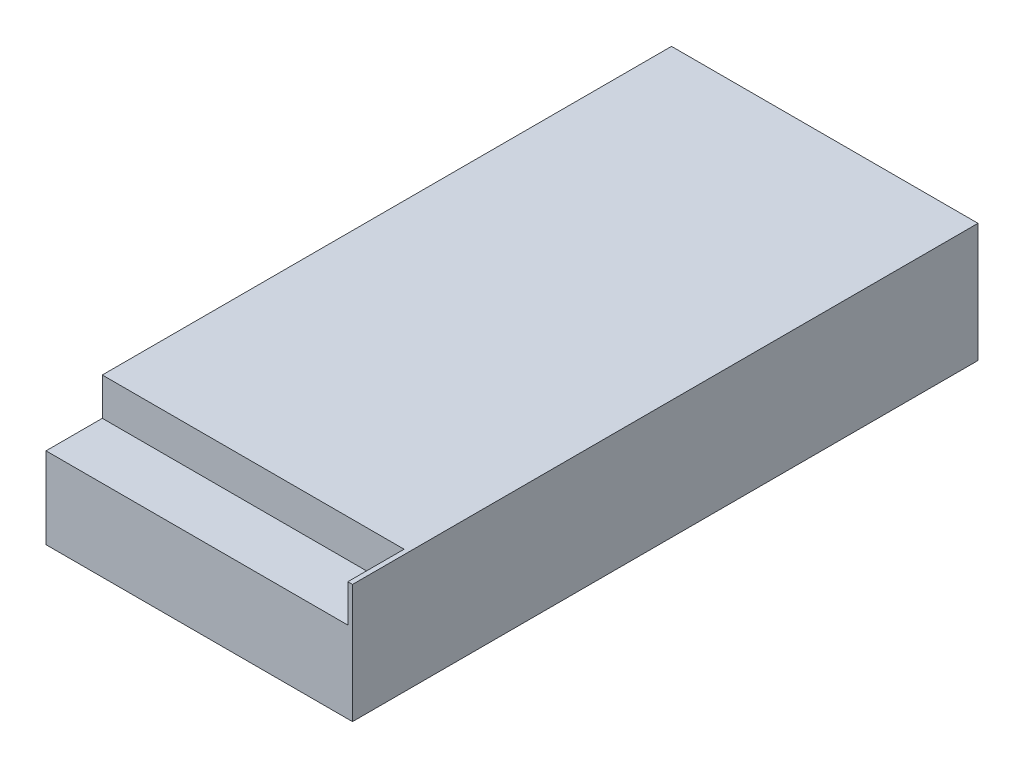
ISO-10303-21;
HEADER;
FILE_DESCRIPTION(('STEP AP214'),'2;1');
FILE_NAME('part.step','',(''),(''),'','','');
FILE_SCHEMA(('AUTOMOTIVE_DESIGN { 1 0 10303 214 1 1 1 1 }'));
ENDSEC;
DATA;
#1=APPLICATION_CONTEXT('core data for automotive mechanical design processes');
#2=APPLICATION_PROTOCOL_DEFINITION('international standard','automotive_design',2000,#1);
#3=PRODUCT_CONTEXT('',#1,'mechanical');
#4=PRODUCT('Part','Part','',(#3));
#5=PRODUCT_RELATED_PRODUCT_CATEGORY('part','',(#4));
#6=PRODUCT_DEFINITION_FORMATION('','',#4);
#7=PRODUCT_DEFINITION_CONTEXT('part definition',#1,'design');
#8=PRODUCT_DEFINITION('design','',#6,#7);
#9=PRODUCT_DEFINITION_SHAPE('','',#8);
#10=(LENGTH_UNIT() NAMED_UNIT(*) SI_UNIT(.MILLI.,.METRE.));
#11=(NAMED_UNIT(*) PLANE_ANGLE_UNIT() SI_UNIT($,.RADIAN.));
#12=(NAMED_UNIT(*) SI_UNIT($,.STERADIAN.) SOLID_ANGLE_UNIT());
#13=UNCERTAINTY_MEASURE_WITH_UNIT(LENGTH_MEASURE(1.E-05),#10,'distance_accuracy_value','');
#14=(GEOMETRIC_REPRESENTATION_CONTEXT(3) GLOBAL_UNCERTAINTY_ASSIGNED_CONTEXT((#13)) GLOBAL_UNIT_ASSIGNED_CONTEXT((#10,
#11,#12)) REPRESENTATION_CONTEXT('',''));
#15=CARTESIAN_POINT('',(0.,0.,0.));
#16=DIRECTION('',(0.,0.,1.));
#17=DIRECTION('',(1.,0.,0.));
#18=AXIS2_PLACEMENT_3D('',#15,#16,#17);
#19=CARTESIAN_POINT('',(49.,38.,-100.));
#20=DIRECTION('',(-1.,0.,0.));
#21=DIRECTION('',(0.,0.,1.));
#22=AXIS2_PLACEMENT_3D('',#19,#20,#21);
#23=PLANE('',#22);
#24=DIRECTION('',(0.,0.,-1.));
#25=VECTOR('',#24,1.);
#26=CARTESIAN_POINT('',(49.,0.,-100.));
#27=LINE('',#26,#25);
#28=CARTESIAN_POINT('',(49.,0.,100.));
#29=VERTEX_POINT('',#28);
#30=CARTESIAN_POINT('',(49.,0.,-100.));
#31=VERTEX_POINT('',#30);
#32=EDGE_CURVE('E162',#29,#31,#27,.T.);
#33=ORIENTED_EDGE('',*,*,#32,.T.);
#34=DIRECTION('',(0.,-1.,0.));
#35=VECTOR('',#34,1.);
#36=CARTESIAN_POINT('',(49.,38.,-100.));
#37=LINE('',#36,#35);
#38=CARTESIAN_POINT('',(49.,38.,-100.));
#39=VERTEX_POINT('',#38);
#40=EDGE_CURVE('E11',#39,#31,#37,.T.);
#41=ORIENTED_EDGE('',*,*,#40,.F.);
#42=DIRECTION('',(0.,0.,-1.));
#43=VECTOR('',#42,1.);
#44=CARTESIAN_POINT('',(49.,38.,-100.));
#45=LINE('',#44,#43);
#46=CARTESIAN_POINT('',(49.,38.,100.));
#47=VERTEX_POINT('',#46);
#48=EDGE_CURVE('E166',#47,#39,#45,.T.);
#49=ORIENTED_EDGE('',*,*,#48,.F.);
#50=DIRECTION('',(0.,-1.,0.));
#51=VECTOR('',#50,1.);
#52=CARTESIAN_POINT('',(49.,38.,100.));
#53=LINE('',#52,#51);
#54=EDGE_CURVE('E173',#47,#29,#53,.T.);
#55=ORIENTED_EDGE('',*,*,#54,.T.);
#56=EDGE_LOOP('',(#33,#41,#49,#55));
#57=FACE_BOUND('',#56,.T.);
#58=ADVANCED_FACE('F34',(#57),#23,.F.);
#59=CARTESIAN_POINT('',(-49.,38.,-100.));
#60=DIRECTION('',(0.,0.,1.));
#61=DIRECTION('',(1.,0.,0.));
#62=AXIS2_PLACEMENT_3D('',#59,#60,#61);
#63=PLANE('',#62);
#64=DIRECTION('',(-1.,0.,0.));
#65=VECTOR('',#64,1.);
#66=CARTESIAN_POINT('',(-49.,0.,-100.));
#67=LINE('',#66,#65);
#68=CARTESIAN_POINT('',(-49.,0.,-100.));
#69=VERTEX_POINT('',#68);
#70=EDGE_CURVE('E176',#31,#69,#67,.T.);
#71=ORIENTED_EDGE('',*,*,#70,.T.);
#72=DIRECTION('',(0.,-1.,0.));
#73=VECTOR('',#72,1.);
#74=CARTESIAN_POINT('',(-49.,38.,-100.));
#75=LINE('',#74,#73);
#76=CARTESIAN_POINT('',(-49.,38.,-100.));
#77=VERTEX_POINT('',#76);
#78=EDGE_CURVE('E41',#77,#69,#75,.T.);
#79=ORIENTED_EDGE('',*,*,#78,.F.);
#80=DIRECTION('',(-1.,0.,0.));
#81=VECTOR('',#80,1.);
#82=CARTESIAN_POINT('',(-49.,38.,-100.));
#83=LINE('',#82,#81);
#84=EDGE_CURVE('E81',#39,#77,#83,.T.);
#85=ORIENTED_EDGE('',*,*,#84,.F.);
#86=ORIENTED_EDGE('',*,*,#40,.T.);
#87=EDGE_LOOP('',(#71,#79,#85,#86));
#88=FACE_BOUND('',#87,.T.);
#89=ADVANCED_FACE('F218',(#88),#63,.F.);
#90=CARTESIAN_POINT('',(-49.,38.,-100.));
#91=DIRECTION('',(1.,0.,0.));
#92=DIRECTION('',(0.,0.,-1.));
#93=AXIS2_PLACEMENT_3D('',#90,#91,#92);
#94=PLANE('',#93);
#95=DIRECTION('',(0.,0.,1.));
#96=VECTOR('',#95,1.);
#97=CARTESIAN_POINT('',(-49.,26.,100.));
#98=LINE('',#97,#96);
#99=CARTESIAN_POINT('',(-49.,26.,82.));
#100=VERTEX_POINT('',#99);
#101=CARTESIAN_POINT('',(-49.,26.,100.));
#102=VERTEX_POINT('',#101);
#103=EDGE_CURVE('E145',#100,#102,#98,.T.);
#104=ORIENTED_EDGE('',*,*,#103,.F.);
#105=DIRECTION('',(0.,1.,0.));
#106=VECTOR('',#105,1.);
#107=CARTESIAN_POINT('',(-49.,26.,82.));
#108=LINE('',#107,#106);
#109=CARTESIAN_POINT('',(-49.,38.,82.));
#110=VERTEX_POINT('',#109);
#111=EDGE_CURVE('E159',#100,#110,#108,.T.);
#112=ORIENTED_EDGE('',*,*,#111,.T.);
#113=DIRECTION('',(0.,0.,1.));
#114=VECTOR('',#113,1.);
#115=CARTESIAN_POINT('',(-49.,38.,-100.));
#116=LINE('',#115,#114);
#117=EDGE_CURVE('E169',#77,#110,#116,.T.);
#118=ORIENTED_EDGE('',*,*,#117,.F.);
#119=ORIENTED_EDGE('',*,*,#78,.T.);
#120=DIRECTION('',(0.,0.,1.));
#121=VECTOR('',#120,1.);
#122=CARTESIAN_POINT('',(-49.,0.,-100.));
#123=LINE('',#122,#121);
#124=CARTESIAN_POINT('',(-49.,0.,100.));
#125=VERTEX_POINT('',#124);
#126=EDGE_CURVE('E178',#69,#125,#123,.T.);
#127=ORIENTED_EDGE('',*,*,#126,.T.);
#128=DIRECTION('',(0.,-1.,0.));
#129=VECTOR('',#128,1.);
#130=CARTESIAN_POINT('',(-49.,38.,100.));
#131=LINE('',#130,#129);
#132=EDGE_CURVE('E183',#102,#125,#131,.T.);
#133=ORIENTED_EDGE('',*,*,#132,.F.);
#134=EDGE_LOOP('',(#104,#112,#118,#119,#127,#133));
#135=FACE_BOUND('',#134,.T.);
#136=ADVANCED_FACE('F189',(#135),#94,.F.);
#137=CARTESIAN_POINT('',(-49.,38.,100.));
#138=DIRECTION('',(0.,0.,-1.));
#139=DIRECTION('',(-1.,0.,0.));
#140=AXIS2_PLACEMENT_3D('',#137,#138,#139);
#141=PLANE('',#140);
#142=DIRECTION('',(1.,0.,0.));
#143=VECTOR('',#142,1.);
#144=CARTESIAN_POINT('',(-49.,38.,100.));
#145=LINE('',#144,#143);
#146=CARTESIAN_POINT('',(47.5,38.,100.));
#147=VERTEX_POINT('',#146);
#148=EDGE_CURVE('E56',#147,#47,#145,.T.);
#149=ORIENTED_EDGE('',*,*,#148,.F.);
#150=DIRECTION('',(0.,1.,0.));
#151=VECTOR('',#150,1.);
#152=CARTESIAN_POINT('',(47.5,26.,100.));
#153=LINE('',#152,#151);
#154=CARTESIAN_POINT('',(47.5,26.,100.));
#155=VERTEX_POINT('',#154);
#156=EDGE_CURVE('E48',#155,#147,#153,.T.);
#157=ORIENTED_EDGE('',*,*,#156,.F.);
#158=DIRECTION('',(1.,0.,0.));
#159=VECTOR('',#158,1.);
#160=CARTESIAN_POINT('',(-49.,26.,100.));
#161=LINE('',#160,#159);
#162=EDGE_CURVE('E147',#102,#155,#161,.T.);
#163=ORIENTED_EDGE('',*,*,#162,.F.);
#164=ORIENTED_EDGE('',*,*,#132,.T.);
#165=DIRECTION('',(1.,0.,0.));
#166=VECTOR('',#165,1.);
#167=CARTESIAN_POINT('',(-49.,0.,100.));
#168=LINE('',#167,#166);
#169=EDGE_CURVE('E76',#125,#29,#168,.T.);
#170=ORIENTED_EDGE('',*,*,#169,.T.);
#171=ORIENTED_EDGE('',*,*,#54,.F.);
#172=EDGE_LOOP('',(#149,#157,#163,#164,#170,#171));
#173=FACE_BOUND('',#172,.T.);
#174=ADVANCED_FACE('F197',(#173),#141,.F.);
#175=CARTESIAN_POINT('',(0.,38.,0.));
#176=DIRECTION('',(0.,1.,0.));
#177=DIRECTION('',(0.,0.,1.));
#178=AXIS2_PLACEMENT_3D('',#175,#176,#177);
#179=PLANE('',#178);
#180=DIRECTION('',(-1.,0.,0.));
#181=VECTOR('',#180,1.);
#182=CARTESIAN_POINT('',(-49.,38.,82.));
#183=LINE('',#182,#181);
#184=CARTESIAN_POINT('',(47.5,38.,82.));
#185=VERTEX_POINT('',#184);
#186=EDGE_CURVE('E148',#185,#110,#183,.T.);
#187=ORIENTED_EDGE('',*,*,#186,.F.);
#188=DIRECTION('',(0.,0.,-1.));
#189=VECTOR('',#188,1.);
#190=CARTESIAN_POINT('',(47.5,38.,100.));
#191=LINE('',#190,#189);
#192=EDGE_CURVE('E144',#147,#185,#191,.T.);
#193=ORIENTED_EDGE('',*,*,#192,.F.);
#194=ORIENTED_EDGE('',*,*,#148,.T.);
#195=ORIENTED_EDGE('',*,*,#48,.T.);
#196=ORIENTED_EDGE('',*,*,#84,.T.);
#197=ORIENTED_EDGE('',*,*,#117,.T.);
#198=EDGE_LOOP('',(#187,#193,#194,#195,#196,#197));
#199=FACE_BOUND('',#198,.T.);
#200=ADVANCED_FACE('F205',(#199),#179,.T.);
#201=CARTESIAN_POINT('',(0.,0.,0.));
#202=DIRECTION('',(0.,1.,0.));
#203=DIRECTION('',(0.,0.,1.));
#204=AXIS2_PLACEMENT_3D('',#201,#202,#203);
#205=PLANE('',#204);
#206=CARTESIAN_POINT('',(-38.,0.,39.));
#207=DIRECTION('',(0.,-1.,0.));
#208=DIRECTION('',(0.,0.,-1.));
#209=AXIS2_PLACEMENT_3D('',#206,#207,#208);
#210=CIRCLE('',#209,1.24999999999999);
#211=CARTESIAN_POINT('',(-38.,0.,37.75));
#212=VERTEX_POINT('',#211);
#213=EDGE_CURVE('E122',#212,#212,#210,.T.);
#214=ORIENTED_EDGE('',*,*,#213,.F.);
#215=EDGE_LOOP('',(#214));
#216=FACE_BOUND('',#215,.T.);
#217=CARTESIAN_POINT('',(41.,0.,39.));
#218=DIRECTION('',(0.,-1.,0.));
#219=DIRECTION('',(0.,0.,-1.));
#220=AXIS2_PLACEMENT_3D('',#217,#218,#219);
#221=CIRCLE('',#220,1.24999999999999);
#222=CARTESIAN_POINT('',(41.,0.,37.75));
#223=VERTEX_POINT('',#222);
#224=EDGE_CURVE('E121',#223,#223,#221,.T.);
#225=ORIENTED_EDGE('',*,*,#224,.F.);
#226=EDGE_LOOP('',(#225));
#227=FACE_BOUND('',#226,.T.);
#228=CARTESIAN_POINT('',(-38.,0.,-81.));
#229=DIRECTION('',(0.,-1.,0.));
#230=DIRECTION('',(0.,0.,-1.));
#231=AXIS2_PLACEMENT_3D('',#228,#229,#230);
#232=CIRCLE('',#231,1.24999999999999);
#233=CARTESIAN_POINT('',(-38.,0.,-82.25));
#234=VERTEX_POINT('',#233);
#235=EDGE_CURVE('E132',#234,#234,#232,.T.);
#236=ORIENTED_EDGE('',*,*,#235,.F.);
#237=EDGE_LOOP('',(#236));
#238=FACE_BOUND('',#237,.T.);
#239=CARTESIAN_POINT('',(41.,0.,-81.));
#240=DIRECTION('',(0.,-1.,0.));
#241=DIRECTION('',(0.,0.,-1.));
#242=AXIS2_PLACEMENT_3D('',#239,#240,#241);
#243=CIRCLE('',#242,1.24999999999999);
#244=CARTESIAN_POINT('',(41.,0.,-82.25));
#245=VERTEX_POINT('',#244);
#246=EDGE_CURVE('E138',#245,#245,#243,.T.);
#247=ORIENTED_EDGE('',*,*,#246,.F.);
#248=EDGE_LOOP('',(#247));
#249=FACE_BOUND('',#248,.T.);
#250=ORIENTED_EDGE('',*,*,#32,.F.);
#251=ORIENTED_EDGE('',*,*,#169,.F.);
#252=ORIENTED_EDGE('',*,*,#126,.F.);
#253=ORIENTED_EDGE('',*,*,#70,.F.);
#254=EDGE_LOOP('',(#250,#251,#252,#253));
#255=FACE_BOUND('',#254,.T.);
#256=ADVANCED_FACE('F193',(#216,#227,#238,#249,#255),#205,.F.);
#257=CARTESIAN_POINT('',(-49.,26.,82.));
#258=DIRECTION('',(0.,0.,-1.));
#259=DIRECTION('',(-1.,0.,0.));
#260=AXIS2_PLACEMENT_3D('',#257,#258,#259);
#261=PLANE('',#260);
#262=ORIENTED_EDGE('',*,*,#186,.T.);
#263=ORIENTED_EDGE('',*,*,#111,.F.);
#264=DIRECTION('',(-1.,0.,0.));
#265=VECTOR('',#264,1.);
#266=CARTESIAN_POINT('',(-49.,26.,82.));
#267=LINE('',#266,#265);
#268=CARTESIAN_POINT('',(47.5,26.,82.));
#269=VERTEX_POINT('',#268);
#270=EDGE_CURVE('E154',#269,#100,#267,.T.);
#271=ORIENTED_EDGE('',*,*,#270,.F.);
#272=DIRECTION('',(0.,1.,0.));
#273=VECTOR('',#272,1.);
#274=CARTESIAN_POINT('',(47.5,26.,82.));
#275=LINE('',#274,#273);
#276=EDGE_CURVE('E163',#269,#185,#275,.T.);
#277=ORIENTED_EDGE('',*,*,#276,.T.);
#278=EDGE_LOOP('',(#262,#263,#271,#277));
#279=FACE_BOUND('',#278,.T.);
#280=ADVANCED_FACE('F203',(#279),#261,.F.);
#281=CARTESIAN_POINT('',(47.5,26.,100.));
#282=DIRECTION('',(1.,0.,0.));
#283=DIRECTION('',(0.,0.,-1.));
#284=AXIS2_PLACEMENT_3D('',#281,#282,#283);
#285=PLANE('',#284);
#286=ORIENTED_EDGE('',*,*,#192,.T.);
#287=ORIENTED_EDGE('',*,*,#276,.F.);
#288=DIRECTION('',(0.,0.,-1.));
#289=VECTOR('',#288,1.);
#290=CARTESIAN_POINT('',(47.5,26.,100.));
#291=LINE('',#290,#289);
#292=EDGE_CURVE('E151',#155,#269,#291,.T.);
#293=ORIENTED_EDGE('',*,*,#292,.F.);
#294=ORIENTED_EDGE('',*,*,#156,.T.);
#295=EDGE_LOOP('',(#286,#287,#293,#294));
#296=FACE_BOUND('',#295,.T.);
#297=ADVANCED_FACE('F206',(#296),#285,.F.);
#298=CARTESIAN_POINT('',(0.,26.,0.));
#299=DIRECTION('',(0.,-1.,0.));
#300=DIRECTION('',(0.,0.,-1.));
#301=AXIS2_PLACEMENT_3D('',#298,#299,#300);
#302=PLANE('',#301);
#303=ORIENTED_EDGE('',*,*,#103,.T.);
#304=ORIENTED_EDGE('',*,*,#162,.T.);
#305=ORIENTED_EDGE('',*,*,#292,.T.);
#306=ORIENTED_EDGE('',*,*,#270,.T.);
#307=EDGE_LOOP('',(#303,#304,#305,#306));
#308=FACE_BOUND('',#307,.T.);
#309=ADVANCED_FACE('F200',(#308),#302,.F.);
#310=CARTESIAN_POINT('',(41.,5.,-81.));
#311=DIRECTION('',(0.,-1.,0.));
#312=DIRECTION('',(0.,0.,-1.));
#313=AXIS2_PLACEMENT_3D('',#310,#311,#312);
#314=CONICAL_SURFACE('',#313,1.25,1.02974425867666);
#315=CARTESIAN_POINT('',(41.,5.75107577378445,-81.));
#316=VERTEX_POINT('',#315);
#317=VERTEX_LOOP('',#316);
#318=FACE_BOUND('',#317,.T.);
#319=CARTESIAN_POINT('',(41.,5.,-81.));
#320=DIRECTION('',(0.,-1.,0.));
#321=DIRECTION('',(0.,0.,-1.));
#322=AXIS2_PLACEMENT_3D('',#319,#320,#321);
#323=CIRCLE('',#322,1.25);
#324=CARTESIAN_POINT('',(41.,5.,-82.25));
#325=VERTEX_POINT('',#324);
#326=EDGE_CURVE('E141',#325,#325,#323,.T.);
#327=ORIENTED_EDGE('',*,*,#326,.T.);
#328=EDGE_LOOP('',(#327));
#329=FACE_BOUND('',#328,.T.);
#330=ADVANCED_FACE('F213',(#318,#329),#314,.F.);
#331=CARTESIAN_POINT('',(41.,0.,-81.));
#332=DIRECTION('',(0.,-1.,0.));
#333=DIRECTION('',(0.,0.,-1.));
#334=AXIS2_PLACEMENT_3D('',#331,#332,#333);
#335=CYLINDRICAL_SURFACE('',#334,1.24999999999999);
#336=ORIENTED_EDGE('',*,*,#326,.F.);
#337=EDGE_LOOP('',(#336));
#338=FACE_BOUND('',#337,.T.);
#339=ORIENTED_EDGE('',*,*,#246,.T.);
#340=EDGE_LOOP('',(#339));
#341=FACE_BOUND('',#340,.T.);
#342=ADVANCED_FACE('F263',(#338,#341),#335,.F.);
#343=CARTESIAN_POINT('',(-38.,5.,-81.));
#344=DIRECTION('',(0.,-1.,0.));
#345=DIRECTION('',(0.,0.,-1.));
#346=AXIS2_PLACEMENT_3D('',#343,#344,#345);
#347=CONICAL_SURFACE('',#346,1.25,1.02974425867666);
#348=CARTESIAN_POINT('',(-38.,5.75107577378445,-81.));
#349=VERTEX_POINT('',#348);
#350=VERTEX_LOOP('',#349);
#351=FACE_BOUND('',#350,.T.);
#352=CARTESIAN_POINT('',(-38.,5.,-81.));
#353=DIRECTION('',(0.,-1.,0.));
#354=DIRECTION('',(0.,0.,-1.));
#355=AXIS2_PLACEMENT_3D('',#352,#353,#354);
#356=CIRCLE('',#355,1.25);
#357=CARTESIAN_POINT('',(-38.,5.,-82.25));
#358=VERTEX_POINT('',#357);
#359=EDGE_CURVE('E135',#358,#358,#356,.T.);
#360=ORIENTED_EDGE('',*,*,#359,.T.);
#361=EDGE_LOOP('',(#360));
#362=FACE_BOUND('',#361,.T.);
#363=ADVANCED_FACE('F270',(#351,#362),#347,.F.);
#364=CARTESIAN_POINT('',(-38.,0.,-81.));
#365=DIRECTION('',(0.,-1.,0.));
#366=DIRECTION('',(0.,0.,-1.));
#367=AXIS2_PLACEMENT_3D('',#364,#365,#366);
#368=CYLINDRICAL_SURFACE('',#367,1.24999999999999);
#369=ORIENTED_EDGE('',*,*,#359,.F.);
#370=EDGE_LOOP('',(#369));
#371=FACE_BOUND('',#370,.T.);
#372=ORIENTED_EDGE('',*,*,#235,.T.);
#373=EDGE_LOOP('',(#372));
#374=FACE_BOUND('',#373,.T.);
#375=ADVANCED_FACE('F278',(#371,#374),#368,.F.);
#376=CARTESIAN_POINT('',(41.,5.,39.));
#377=DIRECTION('',(0.,-1.,0.));
#378=DIRECTION('',(0.,0.,-1.));
#379=AXIS2_PLACEMENT_3D('',#376,#377,#378);
#380=CONICAL_SURFACE('',#379,1.25,1.02974425867666);
#381=CARTESIAN_POINT('',(41.,5.75107577378445,39.));
#382=VERTEX_POINT('',#381);
#383=VERTEX_LOOP('',#382);
#384=FACE_BOUND('',#383,.T.);
#385=CARTESIAN_POINT('',(41.,5.,39.));
#386=DIRECTION('',(0.,-1.,0.));
#387=DIRECTION('',(0.,0.,-1.));
#388=AXIS2_PLACEMENT_3D('',#385,#386,#387);
#389=CIRCLE('',#388,1.25);
#390=CARTESIAN_POINT('',(41.,5.,37.75));
#391=VERTEX_POINT('',#390);
#392=EDGE_CURVE('E125',#391,#391,#389,.T.);
#393=ORIENTED_EDGE('',*,*,#392,.T.);
#394=EDGE_LOOP('',(#393));
#395=FACE_BOUND('',#394,.T.);
#396=ADVANCED_FACE('F286',(#384,#395),#380,.F.);
#397=CARTESIAN_POINT('',(41.,0.,39.));
#398=DIRECTION('',(0.,-1.,0.));
#399=DIRECTION('',(0.,0.,-1.));
#400=AXIS2_PLACEMENT_3D('',#397,#398,#399);
#401=CYLINDRICAL_SURFACE('',#400,1.24999999999999);
#402=ORIENTED_EDGE('',*,*,#392,.F.);
#403=EDGE_LOOP('',(#402));
#404=FACE_BOUND('',#403,.T.);
#405=ORIENTED_EDGE('',*,*,#224,.T.);
#406=EDGE_LOOP('',(#405));
#407=FACE_BOUND('',#406,.T.);
#408=ADVANCED_FACE('F115',(#404,#407),#401,.F.);
#409=CARTESIAN_POINT('',(-38.,5.,39.));
#410=DIRECTION('',(0.,-1.,0.));
#411=DIRECTION('',(0.,0.,-1.));
#412=AXIS2_PLACEMENT_3D('',#409,#410,#411);
#413=CONICAL_SURFACE('',#412,1.25,1.02974425867666);
#414=CARTESIAN_POINT('',(-38.,5.75107577378445,39.));
#415=VERTEX_POINT('',#414);
#416=VERTEX_LOOP('',#415);
#417=FACE_BOUND('',#416,.T.);
#418=CARTESIAN_POINT('',(-38.,5.,39.));
#419=DIRECTION('',(0.,-1.,0.));
#420=DIRECTION('',(0.,0.,-1.));
#421=AXIS2_PLACEMENT_3D('',#418,#419,#420);
#422=CIRCLE('',#421,1.25);
#423=CARTESIAN_POINT('',(-38.,5.,37.75));
#424=VERTEX_POINT('',#423);
#425=EDGE_CURVE('E119',#424,#424,#422,.T.);
#426=ORIENTED_EDGE('',*,*,#425,.T.);
#427=EDGE_LOOP('',(#426));
#428=FACE_BOUND('',#427,.T.);
#429=ADVANCED_FACE('F111',(#417,#428),#413,.F.);
#430=CARTESIAN_POINT('',(-38.,0.,39.));
#431=DIRECTION('',(0.,-1.,0.));
#432=DIRECTION('',(0.,0.,-1.));
#433=AXIS2_PLACEMENT_3D('',#430,#431,#432);
#434=CYLINDRICAL_SURFACE('',#433,1.24999999999999);
#435=ORIENTED_EDGE('',*,*,#425,.F.);
#436=EDGE_LOOP('',(#435));
#437=FACE_BOUND('',#436,.T.);
#438=ORIENTED_EDGE('',*,*,#213,.T.);
#439=EDGE_LOOP('',(#438));
#440=FACE_BOUND('',#439,.T.);
#441=ADVANCED_FACE('F114',(#437,#440),#434,.F.);
#442=CLOSED_SHELL('',(#58,#89,#136,#174,#200,#256,#280,#297,#309,#330,#342,#363,#375,#396,#408,
#429,#441));
#443=MANIFOLD_SOLID_BREP('B2',#442);
#444=ADVANCED_BREP_SHAPE_REPRESENTATION('',(#18,#443),#14);
#445=SHAPE_DEFINITION_REPRESENTATION(#9,#444);
ENDSEC;
END-ISO-10303-21;
